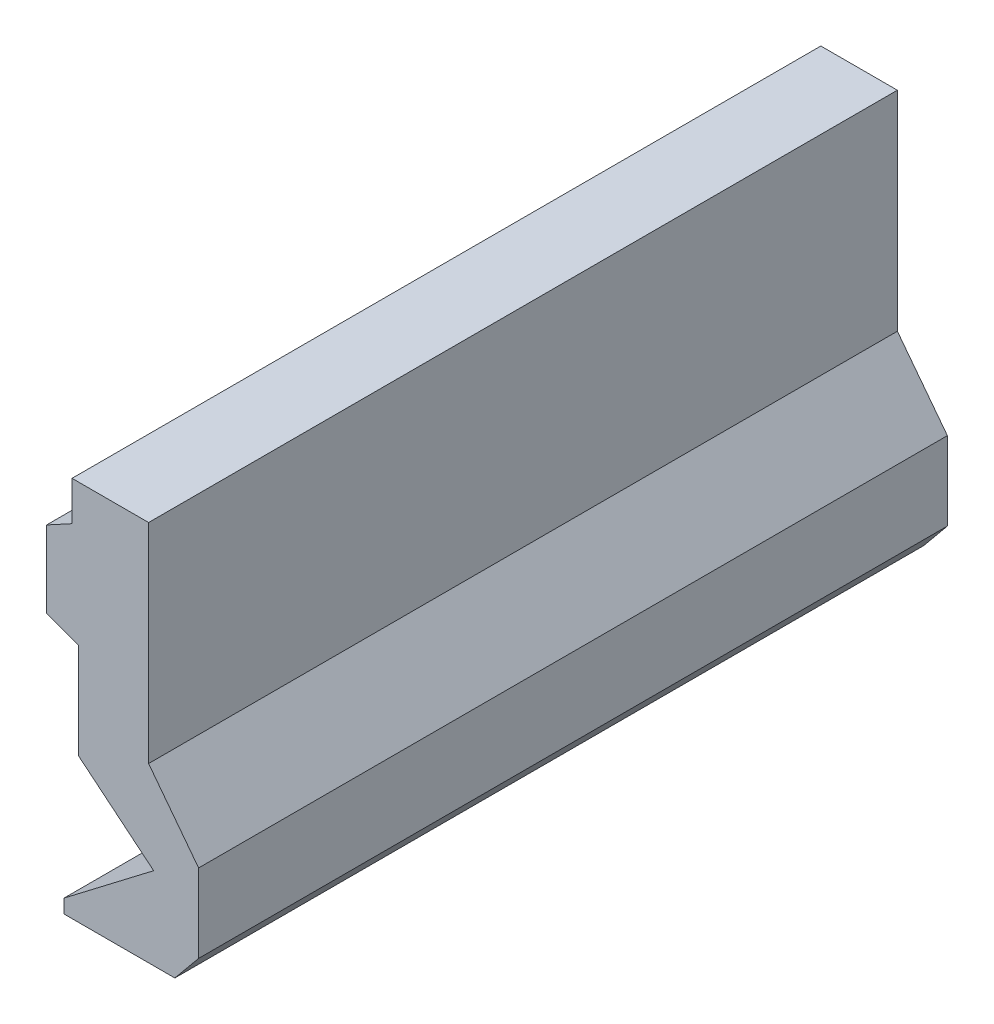
ISO-10303-21;
HEADER;
FILE_DESCRIPTION(('STEP AP214'),'2;1');
FILE_NAME('part.step','',(''),(''),'','','');
FILE_SCHEMA(('AUTOMOTIVE_DESIGN { 1 0 10303 214 1 1 1 1 }'));
ENDSEC;
DATA;
#1=APPLICATION_CONTEXT('core data for automotive mechanical design processes');
#2=APPLICATION_PROTOCOL_DEFINITION('international standard','automotive_design',2000,#1);
#3=PRODUCT_CONTEXT('',#1,'mechanical');
#4=PRODUCT('Part','Part','',(#3));
#5=PRODUCT_RELATED_PRODUCT_CATEGORY('part','',(#4));
#6=PRODUCT_DEFINITION_FORMATION('','',#4);
#7=PRODUCT_DEFINITION_CONTEXT('part definition',#1,'design');
#8=PRODUCT_DEFINITION('design','',#6,#7);
#9=PRODUCT_DEFINITION_SHAPE('','',#8);
#10=(LENGTH_UNIT() NAMED_UNIT(*) SI_UNIT(.MILLI.,.METRE.));
#11=(NAMED_UNIT(*) PLANE_ANGLE_UNIT() SI_UNIT($,.RADIAN.));
#12=(NAMED_UNIT(*) SI_UNIT($,.STERADIAN.) SOLID_ANGLE_UNIT());
#13=UNCERTAINTY_MEASURE_WITH_UNIT(LENGTH_MEASURE(1.E-05),#10,'distance_accuracy_value','');
#14=(GEOMETRIC_REPRESENTATION_CONTEXT(3) GLOBAL_UNCERTAINTY_ASSIGNED_CONTEXT((#13)) GLOBAL_UNIT_ASSIGNED_CONTEXT((#10,
#11,#12)) REPRESENTATION_CONTEXT('',''));
#15=CARTESIAN_POINT('',(0.,0.,0.));
#16=DIRECTION('',(0.,0.,1.));
#17=DIRECTION('',(1.,0.,0.));
#18=AXIS2_PLACEMENT_3D('',#15,#16,#17);
#19=CARTESIAN_POINT('',(1.18005100515699,0.,30.));
#20=DIRECTION('',(1.,0.,0.));
#21=DIRECTION('',(0.,1.,0.));
#22=AXIS2_PLACEMENT_3D('',#19,#20,#21);
#23=PLANE('',#22);
#24=DIRECTION('',(0.,-1.,0.));
#25=VECTOR('',#24,1.);
#26=CARTESIAN_POINT('',(1.18005100515699,0.,0.));
#27=LINE('',#26,#25);
#28=CARTESIAN_POINT('',(1.18005100515699,0.,0.));
#29=VERTEX_POINT('',#28);
#30=CARTESIAN_POINT('',(1.18005100515699,-1.57420528927688,0.));
#31=VERTEX_POINT('',#30);
#32=EDGE_CURVE('E165',#29,#31,#27,.T.);
#33=ORIENTED_EDGE('',*,*,#32,.T.);
#34=DIRECTION('',(0.,0.,-1.));
#35=VECTOR('',#34,1.);
#36=CARTESIAN_POINT('',(1.18005100515699,-1.57420528927688,30.));
#37=LINE('',#36,#35);
#38=CARTESIAN_POINT('',(1.18005100515699,-1.57420528927688,30.));
#39=VERTEX_POINT('',#38);
#40=EDGE_CURVE('E11',#39,#31,#37,.T.);
#41=ORIENTED_EDGE('',*,*,#40,.F.);
#42=DIRECTION('',(0.,-1.,0.));
#43=VECTOR('',#42,1.);
#44=CARTESIAN_POINT('',(1.18005100515699,0.,30.));
#45=LINE('',#44,#43);
#46=CARTESIAN_POINT('',(1.18005100515699,0.,30.));
#47=VERTEX_POINT('',#46);
#48=EDGE_CURVE('E191',#47,#39,#45,.T.);
#49=ORIENTED_EDGE('',*,*,#48,.F.);
#50=DIRECTION('',(0.,0.,-1.));
#51=VECTOR('',#50,1.);
#52=CARTESIAN_POINT('',(1.18005100515699,0.,30.));
#53=LINE('',#52,#51);
#54=EDGE_CURVE('E161',#47,#29,#53,.T.);
#55=ORIENTED_EDGE('',*,*,#54,.T.);
#56=EDGE_LOOP('',(#33,#41,#49,#55));
#57=FACE_BOUND('',#56,.T.);
#58=ADVANCED_FACE('F33',(#57),#23,.F.);
#59=CARTESIAN_POINT('',(1.18005100515699,-1.57420528927688,30.));
#60=DIRECTION('',(0.477191624489301,-0.878799268045474,0.));
#61=DIRECTION('',(0.878799268045474,0.477191624489301,0.));
#62=AXIS2_PLACEMENT_3D('',#59,#60,#61);
#63=PLANE('',#62);
#64=DIRECTION('',(-0.878799268045474,-0.477191624489301,0.));
#65=VECTOR('',#64,1.);
#66=CARTESIAN_POINT('',(1.18005100515699,-1.57420528927688,0.));
#67=LINE('',#66,#65);
#68=CARTESIAN_POINT('',(0.161138111366199,-2.12747919001932,0.));
#69=VERTEX_POINT('',#68);
#70=EDGE_CURVE('E168',#31,#69,#67,.T.);
#71=ORIENTED_EDGE('',*,*,#70,.T.);
#72=DIRECTION('',(0.,0.,-1.));
#73=VECTOR('',#72,1.);
#74=CARTESIAN_POINT('',(0.161138111366199,-2.12747919001932,30.));
#75=LINE('',#74,#73);
#76=CARTESIAN_POINT('',(0.161138111366199,-2.12747919001932,30.));
#77=VERTEX_POINT('',#76);
#78=EDGE_CURVE('E41',#77,#69,#75,.T.);
#79=ORIENTED_EDGE('',*,*,#78,.F.);
#80=DIRECTION('',(-0.878799268045474,-0.477191624489301,0.));
#81=VECTOR('',#80,1.);
#82=CARTESIAN_POINT('',(1.18005100515699,-1.57420528927688,30.));
#83=LINE('',#82,#81);
#84=EDGE_CURVE('E110',#39,#77,#83,.T.);
#85=ORIENTED_EDGE('',*,*,#84,.F.);
#86=ORIENTED_EDGE('',*,*,#40,.T.);
#87=EDGE_LOOP('',(#71,#79,#85,#86));
#88=FACE_BOUND('',#87,.T.);
#89=ADVANCED_FACE('F279',(#88),#63,.F.);
#90=CARTESIAN_POINT('',(0.161138111366199,-2.12747919001932,30.));
#91=DIRECTION('',(1.,0.,0.));
#92=DIRECTION('',(0.,1.,0.));
#93=AXIS2_PLACEMENT_3D('',#90,#91,#92);
#94=PLANE('',#93);
#95=DIRECTION('',(0.,-1.,0.));
#96=VECTOR('',#95,1.);
#97=CARTESIAN_POINT('',(0.161138111366199,-2.12747919001932,0.));
#98=LINE('',#97,#96);
#99=CARTESIAN_POINT('',(0.1611381113662,-5.19930745688569,0.));
#100=VERTEX_POINT('',#99);
#101=EDGE_CURVE('E170',#69,#100,#98,.T.);
#102=ORIENTED_EDGE('',*,*,#101,.T.);
#103=DIRECTION('',(0.,0.,-1.));
#104=VECTOR('',#103,1.);
#105=CARTESIAN_POINT('',(0.1611381113662,-5.19930745688569,30.));
#106=LINE('',#105,#104);
#107=CARTESIAN_POINT('',(0.1611381113662,-5.19930745688569,30.));
#108=VERTEX_POINT('',#107);
#109=EDGE_CURVE('E216',#108,#100,#106,.T.);
#110=ORIENTED_EDGE('',*,*,#109,.F.);
#111=DIRECTION('',(0.,-1.,0.));
#112=VECTOR('',#111,1.);
#113=CARTESIAN_POINT('',(0.161138111366199,-2.12747919001932,30.));
#114=LINE('',#113,#112);
#115=EDGE_CURVE('E224',#77,#108,#114,.T.);
#116=ORIENTED_EDGE('',*,*,#115,.F.);
#117=ORIENTED_EDGE('',*,*,#78,.T.);
#118=EDGE_LOOP('',(#102,#110,#116,#117));
#119=FACE_BOUND('',#118,.T.);
#120=ADVANCED_FACE('F222',(#119),#94,.F.);
#121=CARTESIAN_POINT('',(0.1611381113662,-5.19930745688569,30.));
#122=DIRECTION('',(0.345136683932488,0.938552432954113,0.));
#123=DIRECTION('',(-0.938552432954114,0.345136683932488,0.));
#124=AXIS2_PLACEMENT_3D('',#121,#122,#123);
#125=PLANE('',#124);
#126=DIRECTION('',(0.938552432954113,-0.345136683932488,0.));
#127=VECTOR('',#126,1.);
#128=CARTESIAN_POINT('',(0.1611381113662,-5.19930745688569,0.));
#129=LINE('',#128,#127);
#130=CARTESIAN_POINT('',(1.43962066592966,-5.66944765774663,0.));
#131=VERTEX_POINT('',#130);
#132=EDGE_CURVE('E172',#100,#131,#129,.T.);
#133=ORIENTED_EDGE('',*,*,#132,.T.);
#134=DIRECTION('',(0.,0.,-1.));
#135=VECTOR('',#134,1.);
#136=CARTESIAN_POINT('',(1.43962066592966,-5.66944765774663,30.));
#137=LINE('',#136,#135);
#138=CARTESIAN_POINT('',(1.43962066592966,-5.66944765774663,30.));
#139=VERTEX_POINT('',#138);
#140=EDGE_CURVE('E213',#139,#131,#137,.T.);
#141=ORIENTED_EDGE('',*,*,#140,.F.);
#142=DIRECTION('',(0.938552432954113,-0.345136683932488,0.));
#143=VECTOR('',#142,1.);
#144=CARTESIAN_POINT('',(0.1611381113662,-5.19930745688569,30.));
#145=LINE('',#144,#143);
#146=EDGE_CURVE('E242',#108,#139,#145,.T.);
#147=ORIENTED_EDGE('',*,*,#146,.F.);
#148=ORIENTED_EDGE('',*,*,#109,.T.);
#149=EDGE_LOOP('',(#133,#141,#147,#148));
#150=FACE_BOUND('',#149,.T.);
#151=ADVANCED_FACE('F233',(#150),#125,.F.);
#152=CARTESIAN_POINT('',(1.43962066592966,-5.66944765774663,30.));
#153=DIRECTION('',(1.,0.,0.));
#154=DIRECTION('',(0.,1.,0.));
#155=AXIS2_PLACEMENT_3D('',#152,#153,#154);
#156=PLANE('',#155);
#157=DIRECTION('',(0.,-1.,0.));
#158=VECTOR('',#157,1.);
#159=CARTESIAN_POINT('',(1.43962066592966,-5.66944765774663,0.));
#160=LINE('',#159,#158);
#161=CARTESIAN_POINT('',(1.43962066592966,-9.50021388972799,0.));
#162=VERTEX_POINT('',#161);
#163=EDGE_CURVE('E174',#131,#162,#160,.T.);
#164=ORIENTED_EDGE('',*,*,#163,.T.);
#165=DIRECTION('',(0.,0.,-1.));
#166=VECTOR('',#165,1.);
#167=CARTESIAN_POINT('',(1.43962066592966,-9.50021388972799,30.));
#168=LINE('',#167,#166);
#169=CARTESIAN_POINT('',(1.43962066592966,-9.50021388972799,30.));
#170=VERTEX_POINT('',#169);
#171=EDGE_CURVE('E210',#170,#162,#168,.T.);
#172=ORIENTED_EDGE('',*,*,#171,.F.);
#173=DIRECTION('',(0.,-1.,0.));
#174=VECTOR('',#173,1.);
#175=CARTESIAN_POINT('',(1.43962066592966,-5.66944765774663,30.));
#176=LINE('',#175,#174);
#177=EDGE_CURVE('E239',#139,#170,#176,.T.);
#178=ORIENTED_EDGE('',*,*,#177,.F.);
#179=ORIENTED_EDGE('',*,*,#140,.T.);
#180=EDGE_LOOP('',(#164,#172,#178,#179));
#181=FACE_BOUND('',#180,.T.);
#182=ADVANCED_FACE('F237',(#181),#156,.F.);
#183=CARTESIAN_POINT('',(1.43962066592966,-9.50021388972799,30.));
#184=DIRECTION('',(0.635780057049818,0.771870273464221,0.));
#185=DIRECTION('',(-0.771870273464221,0.635780057049818,0.));
#186=AXIS2_PLACEMENT_3D('',#183,#184,#185);
#187=PLANE('',#186);
#188=DIRECTION('',(0.771870273464221,-0.635780057049818,0.));
#189=VECTOR('',#188,1.);
#190=CARTESIAN_POINT('',(1.43962066592966,-9.50021388972799,0.));
#191=LINE('',#190,#189);
#192=CARTESIAN_POINT('',(4.45034973839225,-11.9801144212783,0.));
#193=VERTEX_POINT('',#192);
#194=EDGE_CURVE('E176',#162,#193,#191,.T.);
#195=ORIENTED_EDGE('',*,*,#194,.T.);
#196=DIRECTION('',(0.,0.,-1.));
#197=VECTOR('',#196,1.);
#198=CARTESIAN_POINT('',(4.45034973839225,-11.9801144212783,30.));
#199=LINE('',#198,#197);
#200=CARTESIAN_POINT('',(4.45034973839225,-11.9801144212783,30.));
#201=VERTEX_POINT('',#200);
#202=EDGE_CURVE('E207',#201,#193,#199,.T.);
#203=ORIENTED_EDGE('',*,*,#202,.F.);
#204=DIRECTION('',(0.771870273464221,-0.635780057049818,0.));
#205=VECTOR('',#204,1.);
#206=CARTESIAN_POINT('',(1.43962066592966,-9.50021388972799,30.));
#207=LINE('',#206,#205);
#208=EDGE_CURVE('E241',#170,#201,#207,.T.);
#209=ORIENTED_EDGE('',*,*,#208,.F.);
#210=ORIENTED_EDGE('',*,*,#171,.T.);
#211=EDGE_LOOP('',(#195,#203,#209,#210));
#212=FACE_BOUND('',#211,.T.);
#213=ADVANCED_FACE('F292',(#212),#187,.F.);
#214=CARTESIAN_POINT('',(4.45034973839225,-11.9801144212783,30.));
#215=DIRECTION('',(0.607326758566864,-0.79445214351065,0.));
#216=DIRECTION('',(0.79445214351065,0.607326758566864,0.));
#217=AXIS2_PLACEMENT_3D('',#214,#215,#216);
#218=PLANE('',#217);
#219=DIRECTION('',(-0.79445214351065,-0.607326758566864,0.));
#220=VECTOR('',#219,1.);
#221=CARTESIAN_POINT('',(4.45034973839225,-11.9801144212783,0.));
#222=LINE('',#221,#220);
#223=CARTESIAN_POINT('',(0.86004082140689,-14.7247614017382,0.));
#224=VERTEX_POINT('',#223);
#225=EDGE_CURVE('E178',#193,#224,#222,.T.);
#226=ORIENTED_EDGE('',*,*,#225,.T.);
#227=DIRECTION('',(0.,0.,-1.));
#228=VECTOR('',#227,1.);
#229=CARTESIAN_POINT('',(0.86004082140689,-14.7247614017382,30.));
#230=LINE('',#229,#228);
#231=CARTESIAN_POINT('',(0.86004082140689,-14.7247614017382,30.));
#232=VERTEX_POINT('',#231);
#233=EDGE_CURVE('E204',#232,#224,#230,.T.);
#234=ORIENTED_EDGE('',*,*,#233,.F.);
#235=DIRECTION('',(-0.79445214351065,-0.607326758566864,0.));
#236=VECTOR('',#235,1.);
#237=CARTESIAN_POINT('',(4.45034973839225,-11.9801144212783,30.));
#238=LINE('',#237,#236);
#239=EDGE_CURVE('E244',#201,#232,#238,.T.);
#240=ORIENTED_EDGE('',*,*,#239,.F.);
#241=ORIENTED_EDGE('',*,*,#202,.T.);
#242=EDGE_LOOP('',(#226,#234,#240,#241));
#243=FACE_BOUND('',#242,.T.);
#244=ADVANCED_FACE('F295',(#243),#218,.F.);
#245=CARTESIAN_POINT('',(0.86004082140689,-14.7247614017382,30.));
#246=DIRECTION('',(1.,0.,0.));
#247=DIRECTION('',(0.,1.,0.));
#248=AXIS2_PLACEMENT_3D('',#245,#246,#247);
#249=PLANE('',#248);
#250=DIRECTION('',(0.,-1.,0.));
#251=VECTOR('',#250,1.);
#252=CARTESIAN_POINT('',(0.86004082140689,-14.7247614017382,0.));
#253=LINE('',#252,#251);
#254=CARTESIAN_POINT('',(0.86004082140689,-15.2788271247983,0.));
#255=VERTEX_POINT('',#254);
#256=EDGE_CURVE('E180',#224,#255,#253,.T.);
#257=ORIENTED_EDGE('',*,*,#256,.T.);
#258=DIRECTION('',(0.,0.,-1.));
#259=VECTOR('',#258,1.);
#260=CARTESIAN_POINT('',(0.86004082140689,-15.2788271247983,30.));
#261=LINE('',#260,#259);
#262=CARTESIAN_POINT('',(0.86004082140689,-15.2788271247983,30.));
#263=VERTEX_POINT('',#262);
#264=EDGE_CURVE('E201',#263,#255,#261,.T.);
#265=ORIENTED_EDGE('',*,*,#264,.F.);
#266=DIRECTION('',(0.,-1.,0.));
#267=VECTOR('',#266,1.);
#268=CARTESIAN_POINT('',(0.86004082140689,-14.7247614017382,30.));
#269=LINE('',#268,#267);
#270=EDGE_CURVE('E250',#232,#263,#269,.T.);
#271=ORIENTED_EDGE('',*,*,#270,.F.);
#272=ORIENTED_EDGE('',*,*,#233,.T.);
#273=EDGE_LOOP('',(#257,#265,#271,#272));
#274=FACE_BOUND('',#273,.T.);
#275=ADVANCED_FACE('F299',(#274),#249,.F.);
#276=CARTESIAN_POINT('',(0.86004082140689,-15.2788271247983,30.));
#277=DIRECTION('',(0.,1.,0.));
#278=DIRECTION('',(0.,0.,1.));
#279=AXIS2_PLACEMENT_3D('',#276,#277,#278);
#280=PLANE('',#279);
#281=DIRECTION('',(1.,0.,0.));
#282=VECTOR('',#281,1.);
#283=CARTESIAN_POINT('',(0.86004082140689,-15.2788271247983,0.));
#284=LINE('',#283,#282);
#285=CARTESIAN_POINT('',(5.2985061904386,-15.2788271247983,0.));
#286=VERTEX_POINT('',#285);
#287=EDGE_CURVE('E182',#255,#286,#284,.T.);
#288=ORIENTED_EDGE('',*,*,#287,.T.);
#289=DIRECTION('',(0.,0.,-1.));
#290=VECTOR('',#289,1.);
#291=CARTESIAN_POINT('',(5.2985061904386,-15.2788271247983,30.));
#292=LINE('',#291,#290);
#293=CARTESIAN_POINT('',(5.2985061904386,-15.2788271247983,30.));
#294=VERTEX_POINT('',#293);
#295=EDGE_CURVE('E198',#294,#286,#292,.T.);
#296=ORIENTED_EDGE('',*,*,#295,.F.);
#297=DIRECTION('',(1.,0.,0.));
#298=VECTOR('',#297,1.);
#299=CARTESIAN_POINT('',(0.86004082140689,-15.2788271247983,30.));
#300=LINE('',#299,#298);
#301=EDGE_CURVE('E252',#263,#294,#300,.T.);
#302=ORIENTED_EDGE('',*,*,#301,.F.);
#303=ORIENTED_EDGE('',*,*,#264,.T.);
#304=EDGE_LOOP('',(#288,#296,#302,#303));
#305=FACE_BOUND('',#304,.T.);
#306=ADVANCED_FACE('F303',(#305),#280,.F.);
#307=CARTESIAN_POINT('',(5.2985061904386,-15.2788271247983,30.));
#308=DIRECTION('',(-0.771870273464221,0.635780057049817,0.));
#309=DIRECTION('',(-0.635780057049817,-0.771870273464221,0.));
#310=AXIS2_PLACEMENT_3D('',#307,#308,#309);
#311=PLANE('',#310);
#312=DIRECTION('',(0.635780057049817,0.771870273464221,0.));
#313=VECTOR('',#312,1.);
#314=CARTESIAN_POINT('',(5.2985061904386,-15.2788271247983,0.));
#315=LINE('',#314,#313);
#316=CARTESIAN_POINT('',(6.25076884547655,-14.1227304089551,0.));
#317=VERTEX_POINT('',#316);
#318=EDGE_CURVE('E184',#286,#317,#315,.T.);
#319=ORIENTED_EDGE('',*,*,#318,.T.);
#320=DIRECTION('',(0.,0.,-1.));
#321=VECTOR('',#320,1.);
#322=CARTESIAN_POINT('',(6.25076884547655,-14.1227304089551,30.));
#323=LINE('',#322,#321);
#324=CARTESIAN_POINT('',(6.25076884547655,-14.1227304089551,30.));
#325=VERTEX_POINT('',#324);
#326=EDGE_CURVE('E195',#325,#317,#323,.T.);
#327=ORIENTED_EDGE('',*,*,#326,.F.);
#328=DIRECTION('',(0.635780057049817,0.771870273464221,0.));
#329=VECTOR('',#328,1.);
#330=CARTESIAN_POINT('',(5.2985061904386,-15.2788271247983,30.));
#331=LINE('',#330,#329);
#332=EDGE_CURVE('E254',#294,#325,#331,.T.);
#333=ORIENTED_EDGE('',*,*,#332,.F.);
#334=ORIENTED_EDGE('',*,*,#295,.T.);
#335=EDGE_LOOP('',(#319,#327,#333,#334));
#336=FACE_BOUND('',#335,.T.);
#337=ADVANCED_FACE('F260',(#336),#311,.F.);
#338=CARTESIAN_POINT('',(6.25076884547655,-14.1227304089551,30.));
#339=DIRECTION('',(-1.,0.,0.));
#340=DIRECTION('',(0.,0.,1.));
#341=AXIS2_PLACEMENT_3D('',#338,#339,#340);
#342=PLANE('',#341);
#343=DIRECTION('',(0.,1.,0.));
#344=VECTOR('',#343,1.);
#345=CARTESIAN_POINT('',(6.25076884547655,-14.1227304089551,0.));
#346=LINE('',#345,#344);
#347=CARTESIAN_POINT('',(6.25076884547655,-10.9840269215946,0.));
#348=VERTEX_POINT('',#347);
#349=EDGE_CURVE('E186',#317,#348,#346,.T.);
#350=ORIENTED_EDGE('',*,*,#349,.T.);
#351=DIRECTION('',(0.,0.,-1.));
#352=VECTOR('',#351,1.);
#353=CARTESIAN_POINT('',(6.25076884547655,-10.9840269215946,30.));
#354=LINE('',#353,#352);
#355=CARTESIAN_POINT('',(6.25076884547655,-10.9840269215946,30.));
#356=VERTEX_POINT('',#355);
#357=EDGE_CURVE('E156',#356,#348,#354,.T.);
#358=ORIENTED_EDGE('',*,*,#357,.F.);
#359=DIRECTION('',(0.,1.,0.));
#360=VECTOR('',#359,1.);
#361=CARTESIAN_POINT('',(6.25076884547655,-14.1227304089551,30.));
#362=LINE('',#361,#360);
#363=EDGE_CURVE('E147',#325,#356,#362,.T.);
#364=ORIENTED_EDGE('',*,*,#363,.F.);
#365=ORIENTED_EDGE('',*,*,#326,.T.);
#366=EDGE_LOOP('',(#350,#358,#364,#365));
#367=FACE_BOUND('',#366,.T.);
#368=ADVANCED_FACE('F264',(#367),#342,.F.);
#369=CARTESIAN_POINT('',(6.25076884547655,-10.9840269215946,30.));
#370=DIRECTION('',(-0.79445214351065,-0.607326758566864,0.));
#371=DIRECTION('',(0.607326758566864,-0.79445214351065,0.));
#372=AXIS2_PLACEMENT_3D('',#369,#370,#371);
#373=PLANE('',#372);
#374=DIRECTION('',(-0.607326758566864,0.79445214351065,0.));
#375=VECTOR('',#374,1.);
#376=CARTESIAN_POINT('',(6.25076884547655,-10.9840269215946,0.));
#377=LINE('',#376,#375);
#378=CARTESIAN_POINT('',(4.24731522594888,-8.36328281637224,0.));
#379=VERTEX_POINT('',#378);
#380=EDGE_CURVE('E155',#348,#379,#377,.T.);
#381=ORIENTED_EDGE('',*,*,#380,.T.);
#382=DIRECTION('',(0.,0.,-1.));
#383=VECTOR('',#382,1.);
#384=CARTESIAN_POINT('',(4.24731522594888,-8.36328281637224,30.));
#385=LINE('',#384,#383);
#386=CARTESIAN_POINT('',(4.24731522594888,-8.36328281637224,30.));
#387=VERTEX_POINT('',#386);
#388=EDGE_CURVE('E152',#387,#379,#385,.T.);
#389=ORIENTED_EDGE('',*,*,#388,.F.);
#390=DIRECTION('',(-0.607326758566864,0.79445214351065,0.));
#391=VECTOR('',#390,1.);
#392=CARTESIAN_POINT('',(6.25076884547655,-10.9840269215946,30.));
#393=LINE('',#392,#391);
#394=EDGE_CURVE('E141',#356,#387,#393,.T.);
#395=ORIENTED_EDGE('',*,*,#394,.F.);
#396=ORIENTED_EDGE('',*,*,#357,.T.);
#397=EDGE_LOOP('',(#381,#389,#395,#396));
#398=FACE_BOUND('',#397,.T.);
#399=ADVANCED_FACE('F153',(#398),#373,.F.);
#400=CARTESIAN_POINT('',(4.24731522594888,-8.36328281637224,30.));
#401=DIRECTION('',(-1.,0.,0.));
#402=DIRECTION('',(0.,0.,1.));
#403=AXIS2_PLACEMENT_3D('',#400,#401,#402);
#404=PLANE('',#403);
#405=DIRECTION('',(0.,1.,0.));
#406=VECTOR('',#405,1.);
#407=CARTESIAN_POINT('',(4.24731522594888,-8.36328281637224,0.));
#408=LINE('',#407,#406);
#409=CARTESIAN_POINT('',(4.24731522594888,0.,0.));
#410=VERTEX_POINT('',#409);
#411=EDGE_CURVE('E96',#379,#410,#408,.T.);
#412=ORIENTED_EDGE('',*,*,#411,.T.);
#413=DIRECTION('',(0.,0.,-1.));
#414=VECTOR('',#413,1.);
#415=CARTESIAN_POINT('',(4.24731522594888,0.,30.));
#416=LINE('',#415,#414);
#417=CARTESIAN_POINT('',(4.24731522594888,0.,30.));
#418=VERTEX_POINT('',#417);
#419=EDGE_CURVE('E157',#418,#410,#416,.T.);
#420=ORIENTED_EDGE('',*,*,#419,.F.);
#421=DIRECTION('',(0.,1.,0.));
#422=VECTOR('',#421,1.);
#423=CARTESIAN_POINT('',(4.24731522594888,-8.36328281637224,30.));
#424=LINE('',#423,#422);
#425=EDGE_CURVE('E145',#387,#418,#424,.T.);
#426=ORIENTED_EDGE('',*,*,#425,.F.);
#427=ORIENTED_EDGE('',*,*,#388,.T.);
#428=EDGE_LOOP('',(#412,#420,#426,#427));
#429=FACE_BOUND('',#428,.T.);
#430=ADVANCED_FACE('F159',(#429),#404,.F.);
#431=CARTESIAN_POINT('',(4.24731522594888,0.,30.));
#432=DIRECTION('',(0.,-1.,0.));
#433=DIRECTION('',(1.,0.,0.));
#434=AXIS2_PLACEMENT_3D('',#431,#432,#433);
#435=PLANE('',#434);
#436=DIRECTION('',(-1.,0.,0.));
#437=VECTOR('',#436,1.);
#438=CARTESIAN_POINT('',(4.24731522594888,0.,0.));
#439=LINE('',#438,#437);
#440=EDGE_CURVE('E102',#410,#29,#439,.T.);
#441=ORIENTED_EDGE('',*,*,#440,.T.);
#442=ORIENTED_EDGE('',*,*,#54,.F.);
#443=DIRECTION('',(-1.,0.,0.));
#444=VECTOR('',#443,1.);
#445=CARTESIAN_POINT('',(4.24731522594888,0.,30.));
#446=LINE('',#445,#444);
#447=EDGE_CURVE('E49',#418,#47,#446,.T.);
#448=ORIENTED_EDGE('',*,*,#447,.F.);
#449=ORIENTED_EDGE('',*,*,#419,.T.);
#450=EDGE_LOOP('',(#441,#442,#448,#449));
#451=FACE_BOUND('',#450,.T.);
#452=ADVANCED_FACE('F268',(#451),#435,.F.);
#453=CARTESIAN_POINT('',(0.,0.,30.));
#454=DIRECTION('',(0.,0.,1.));
#455=DIRECTION('',(1.,0.,0.));
#456=AXIS2_PLACEMENT_3D('',#453,#454,#455);
#457=PLANE('',#456);
#458=ORIENTED_EDGE('',*,*,#48,.T.);
#459=ORIENTED_EDGE('',*,*,#84,.T.);
#460=ORIENTED_EDGE('',*,*,#115,.T.);
#461=ORIENTED_EDGE('',*,*,#146,.T.);
#462=ORIENTED_EDGE('',*,*,#177,.T.);
#463=ORIENTED_EDGE('',*,*,#208,.T.);
#464=ORIENTED_EDGE('',*,*,#239,.T.);
#465=ORIENTED_EDGE('',*,*,#270,.T.);
#466=ORIENTED_EDGE('',*,*,#301,.T.);
#467=ORIENTED_EDGE('',*,*,#332,.T.);
#468=ORIENTED_EDGE('',*,*,#363,.T.);
#469=ORIENTED_EDGE('',*,*,#394,.T.);
#470=ORIENTED_EDGE('',*,*,#425,.T.);
#471=ORIENTED_EDGE('',*,*,#447,.T.);
#472=EDGE_LOOP('',(#458,#459,#460,#461,#462,#463,#464,#465,#466,#467,#468,#469,#470,#471));
#473=FACE_BOUND('',#472,.T.);
#474=ADVANCED_FACE('F143',(#473),#457,.T.);
#475=CARTESIAN_POINT('',(0.,0.,0.));
#476=DIRECTION('',(0.,0.,1.));
#477=DIRECTION('',(1.,0.,0.));
#478=AXIS2_PLACEMENT_3D('',#475,#476,#477);
#479=PLANE('',#478);
#480=ORIENTED_EDGE('',*,*,#32,.F.);
#481=ORIENTED_EDGE('',*,*,#440,.F.);
#482=ORIENTED_EDGE('',*,*,#411,.F.);
#483=ORIENTED_EDGE('',*,*,#380,.F.);
#484=ORIENTED_EDGE('',*,*,#349,.F.);
#485=ORIENTED_EDGE('',*,*,#318,.F.);
#486=ORIENTED_EDGE('',*,*,#287,.F.);
#487=ORIENTED_EDGE('',*,*,#256,.F.);
#488=ORIENTED_EDGE('',*,*,#225,.F.);
#489=ORIENTED_EDGE('',*,*,#194,.F.);
#490=ORIENTED_EDGE('',*,*,#163,.F.);
#491=ORIENTED_EDGE('',*,*,#132,.F.);
#492=ORIENTED_EDGE('',*,*,#101,.F.);
#493=ORIENTED_EDGE('',*,*,#70,.F.);
#494=EDGE_LOOP('',(#480,#481,#482,#483,#484,#485,#486,#487,#488,#489,#490,#491,#492,#493));
#495=FACE_BOUND('',#494,.T.);
#496=ADVANCED_FACE('F228',(#495),#479,.F.);
#497=CLOSED_SHELL('',(#58,#89,#120,#151,#182,#213,#244,#275,#306,#337,#368,#399,#430,#452,#474,#496));
#498=MANIFOLD_SOLID_BREP('B2',#497);
#499=ADVANCED_BREP_SHAPE_REPRESENTATION('',(#18,#498),#14);
#500=SHAPE_DEFINITION_REPRESENTATION(#9,#499);
ENDSEC;
END-ISO-10303-21;
